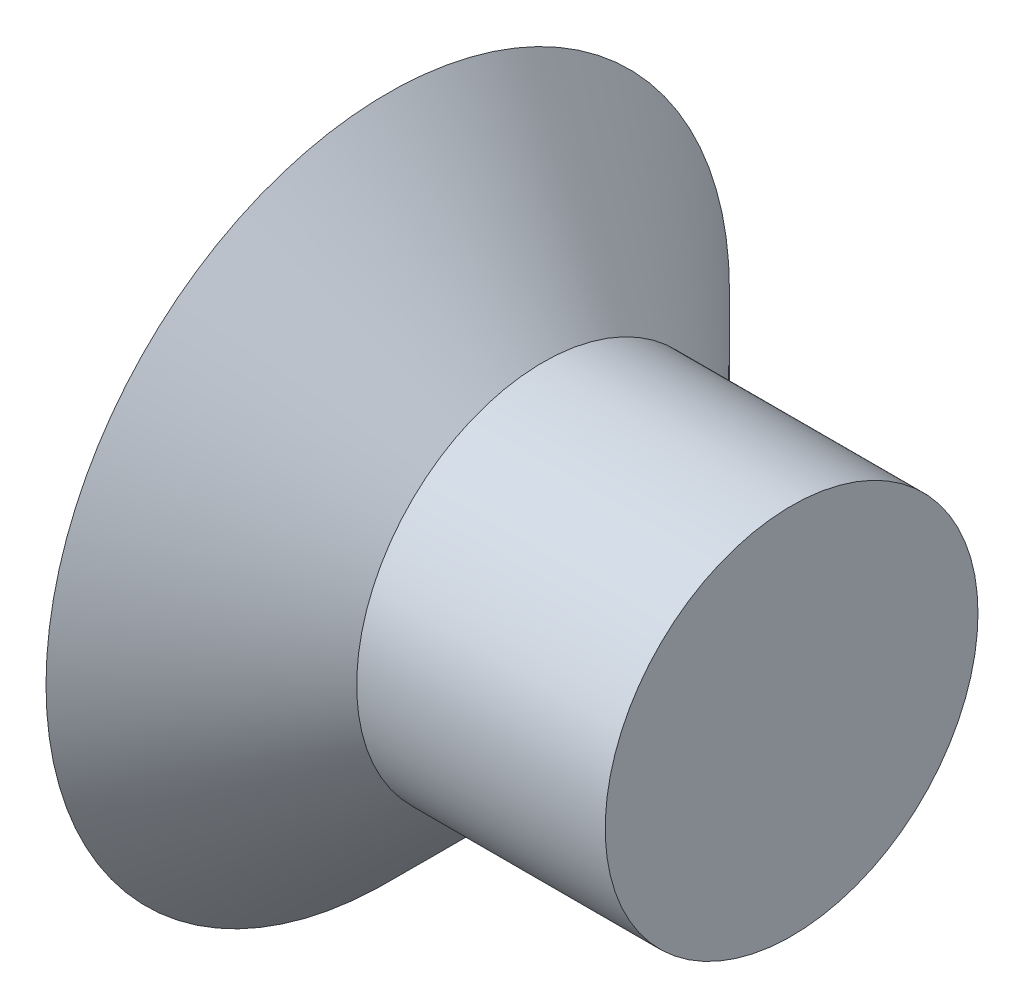
ISO-10303-21;
HEADER;
FILE_DESCRIPTION(('STEP AP214'),'2;1');
FILE_NAME('part.step','',(''),(''),'','','');
FILE_SCHEMA(('AUTOMOTIVE_DESIGN { 1 0 10303 214 1 1 1 1 }'));
ENDSEC;
DATA;
#1=APPLICATION_CONTEXT('core data for automotive mechanical design processes');
#2=APPLICATION_PROTOCOL_DEFINITION('international standard','automotive_design',2000,#1);
#3=PRODUCT_CONTEXT('',#1,'mechanical');
#4=PRODUCT('Part','Part','',(#3));
#5=PRODUCT_RELATED_PRODUCT_CATEGORY('part','',(#4));
#6=PRODUCT_DEFINITION_FORMATION('','',#4);
#7=PRODUCT_DEFINITION_CONTEXT('part definition',#1,'design');
#8=PRODUCT_DEFINITION('design','',#6,#7);
#9=PRODUCT_DEFINITION_SHAPE('','',#8);
#10=(LENGTH_UNIT() NAMED_UNIT(*) SI_UNIT(.MILLI.,.METRE.));
#11=(NAMED_UNIT(*) PLANE_ANGLE_UNIT() SI_UNIT($,.RADIAN.));
#12=(NAMED_UNIT(*) SI_UNIT($,.STERADIAN.) SOLID_ANGLE_UNIT());
#13=UNCERTAINTY_MEASURE_WITH_UNIT(LENGTH_MEASURE(1.E-05),#10,'distance_accuracy_value','');
#14=(GEOMETRIC_REPRESENTATION_CONTEXT(3) GLOBAL_UNCERTAINTY_ASSIGNED_CONTEXT((#13)) GLOBAL_UNIT_ASSIGNED_CONTEXT((#10,
#11,#12)) REPRESENTATION_CONTEXT('',''));
#15=CARTESIAN_POINT('',(0.,0.,0.));
#16=DIRECTION('',(0.,0.,1.));
#17=DIRECTION('',(1.,0.,0.));
#18=AXIS2_PLACEMENT_3D('',#15,#16,#17);
#19=CARTESIAN_POINT('',(0.,0.,0.));
#20=DIRECTION('',(-1.,0.,0.));
#21=DIRECTION('',(0.,0.,1.));
#22=AXIS2_PLACEMENT_3D('',#19,#20,#21);
#23=PLANE('',#22);
#24=CARTESIAN_POINT('',(0.,0.,0.));
#25=DIRECTION('',(1.,0.,0.));
#26=DIRECTION('',(0.,0.,-1.));
#27=AXIS2_PLACEMENT_3D('',#24,#25,#26);
#28=CIRCLE('',#27,11.);
#29=CARTESIAN_POINT('',(0.,0.,-11.));
#30=VERTEX_POINT('',#29);
#31=EDGE_CURVE('E10',#30,#30,#28,.T.);
#32=ORIENTED_EDGE('',*,*,#31,.F.);
#33=EDGE_LOOP('',(#32));
#34=FACE_BOUND('',#33,.T.);
#35=ADVANCED_FACE('F31',(#34),#23,.T.);
#36=CARTESIAN_POINT('',(4.99999999999995,0.,0.));
#37=DIRECTION('',(-1.,0.,0.));
#38=DIRECTION('',(0.,0.,1.));
#39=AXIS2_PLACEMENT_3D('',#36,#37,#38);
#40=CONICAL_SURFACE('',#39,6.,0.785398163397453);
#41=ORIENTED_EDGE('',*,*,#31,.T.);
#42=EDGE_LOOP('',(#41));
#43=FACE_BOUND('',#42,.T.);
#44=CARTESIAN_POINT('',(4.99999999999995,0.,0.));
#45=DIRECTION('',(1.,0.,0.));
#46=DIRECTION('',(0.,0.,-1.));
#47=AXIS2_PLACEMENT_3D('',#44,#45,#46);
#48=CIRCLE('',#47,6.);
#49=CARTESIAN_POINT('',(4.99999999999995,0.,-6.));
#50=VERTEX_POINT('',#49);
#51=EDGE_CURVE('E37',#50,#50,#48,.T.);
#52=ORIENTED_EDGE('',*,*,#51,.F.);
#53=EDGE_LOOP('',(#52));
#54=FACE_BOUND('',#53,.T.);
#55=ADVANCED_FACE('F52',(#43,#54),#40,.T.);
#56=CARTESIAN_POINT('',(12.9999999999999,0.,0.));
#57=DIRECTION('',(1.,0.,0.));
#58=DIRECTION('',(0.,0.,-1.));
#59=AXIS2_PLACEMENT_3D('',#56,#57,#58);
#60=CYLINDRICAL_SURFACE('',#59,6.);
#61=ORIENTED_EDGE('',*,*,#51,.T.);
#62=EDGE_LOOP('',(#61));
#63=FACE_BOUND('',#62,.T.);
#64=CARTESIAN_POINT('',(12.9999999999999,0.,0.));
#65=DIRECTION('',(1.,0.,0.));
#66=DIRECTION('',(0.,0.,-1.));
#67=AXIS2_PLACEMENT_3D('',#64,#65,#66);
#68=CIRCLE('',#67,6.);
#69=CARTESIAN_POINT('',(12.9999999999999,0.,-6.));
#70=VERTEX_POINT('',#69);
#71=EDGE_CURVE('E41',#70,#70,#68,.T.);
#72=ORIENTED_EDGE('',*,*,#71,.F.);
#73=EDGE_LOOP('',(#72));
#74=FACE_BOUND('',#73,.T.);
#75=ADVANCED_FACE('F50',(#63,#74),#60,.T.);
#76=CARTESIAN_POINT('',(12.9999999999999,6.,0.));
#77=DIRECTION('',(1.,0.,0.));
#78=DIRECTION('',(0.,0.,-1.));
#79=AXIS2_PLACEMENT_3D('',#76,#77,#78);
#80=PLANE('',#79);
#81=ORIENTED_EDGE('',*,*,#71,.T.);
#82=EDGE_LOOP('',(#81));
#83=FACE_BOUND('',#82,.T.);
#84=ADVANCED_FACE('F48',(#83),#80,.T.);
#85=CLOSED_SHELL('',(#35,#55,#75,#84));
#86=MANIFOLD_SOLID_BREP('B2',#85);
#87=ADVANCED_BREP_SHAPE_REPRESENTATION('',(#18,#86),#14);
#88=SHAPE_DEFINITION_REPRESENTATION(#9,#87);
ENDSEC;
END-ISO-10303-21;
